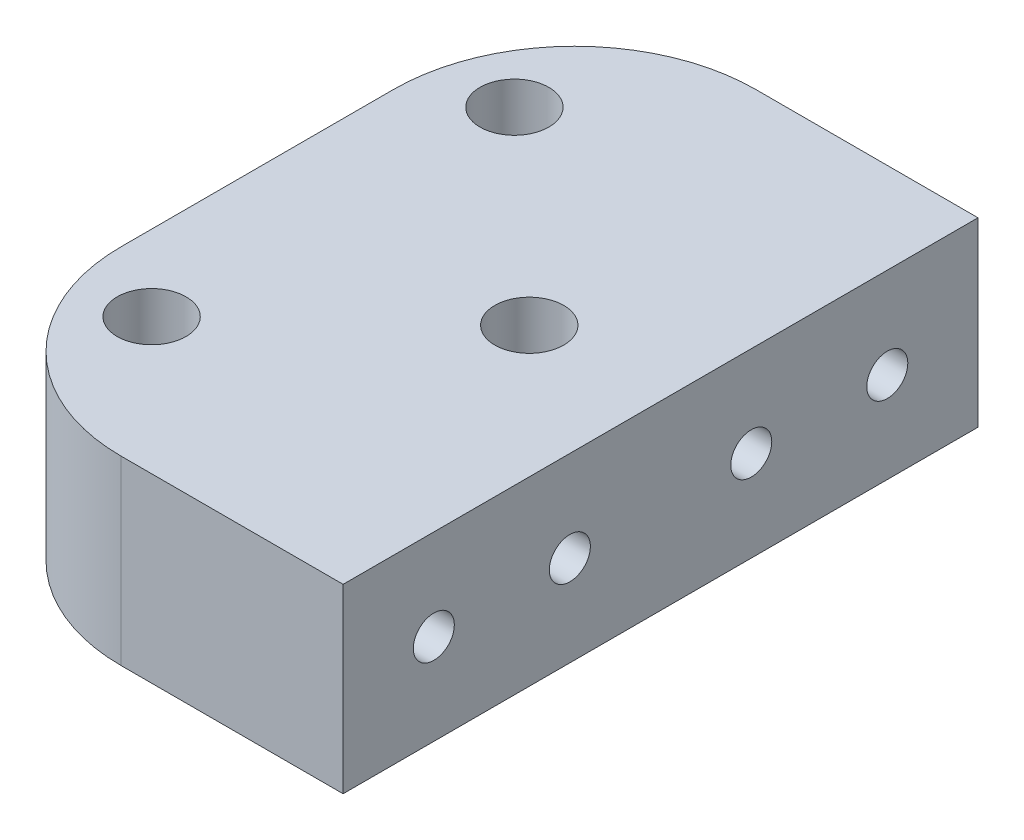
ISO-10303-21;
HEADER;
FILE_DESCRIPTION(('STEP AP214'),'2;1');
FILE_NAME('part.step','',(''),(''),'','','');
FILE_SCHEMA(('AUTOMOTIVE_DESIGN { 1 0 10303 214 1 1 1 1 }'));
ENDSEC;
DATA;
#1=APPLICATION_CONTEXT('core data for automotive mechanical design processes');
#2=APPLICATION_PROTOCOL_DEFINITION('international standard','automotive_design',2000,#1);
#3=PRODUCT_CONTEXT('',#1,'mechanical');
#4=PRODUCT('Part','Part','',(#3));
#5=PRODUCT_RELATED_PRODUCT_CATEGORY('part','',(#4));
#6=PRODUCT_DEFINITION_FORMATION('','',#4);
#7=PRODUCT_DEFINITION_CONTEXT('part definition',#1,'design');
#8=PRODUCT_DEFINITION('design','',#6,#7);
#9=PRODUCT_DEFINITION_SHAPE('','',#8);
#10=(LENGTH_UNIT() NAMED_UNIT(*) SI_UNIT(.MILLI.,.METRE.));
#11=(NAMED_UNIT(*) PLANE_ANGLE_UNIT() SI_UNIT($,.RADIAN.));
#12=(NAMED_UNIT(*) SI_UNIT($,.STERADIAN.) SOLID_ANGLE_UNIT());
#13=UNCERTAINTY_MEASURE_WITH_UNIT(LENGTH_MEASURE(1.E-05),#10,'distance_accuracy_value','');
#14=(GEOMETRIC_REPRESENTATION_CONTEXT(3) GLOBAL_UNCERTAINTY_ASSIGNED_CONTEXT((#13)) GLOBAL_UNIT_ASSIGNED_CONTEXT((#10,
#11,#12)) REPRESENTATION_CONTEXT('',''));
#15=CARTESIAN_POINT('',(0.,0.,0.));
#16=DIRECTION('',(0.,0.,1.));
#17=DIRECTION('',(1.,0.,0.));
#18=AXIS2_PLACEMENT_3D('',#15,#16,#17);
#19=CARTESIAN_POINT('',(11.11875,10.,-17.5));
#20=DIRECTION('',(-1.,0.,0.));
#21=DIRECTION('',(0.,0.,1.));
#22=AXIS2_PLACEMENT_3D('',#19,#20,#21);
#23=PLANE('',#22);
#24=CARTESIAN_POINT('',(11.11875,5.,12.5));
#25=DIRECTION('',(1.,0.,0.));
#26=DIRECTION('',(0.,0.,-1.));
#27=AXIS2_PLACEMENT_3D('',#24,#25,#26);
#28=CIRCLE('',#27,1.1303);
#29=CARTESIAN_POINT('',(11.11875,5.,11.3697));
#30=VERTEX_POINT('',#29);
#31=EDGE_CURVE('E112',#30,#30,#28,.T.);
#32=ORIENTED_EDGE('',*,*,#31,.F.);
#33=EDGE_LOOP('',(#32));
#34=FACE_BOUND('',#33,.T.);
#35=CARTESIAN_POINT('',(11.11875,5.,-12.5));
#36=DIRECTION('',(1.,0.,0.));
#37=DIRECTION('',(0.,0.,-1.));
#38=AXIS2_PLACEMENT_3D('',#35,#36,#37);
#39=CIRCLE('',#38,1.1303);
#40=CARTESIAN_POINT('',(11.11875,5.,-13.6303));
#41=VERTEX_POINT('',#40);
#42=EDGE_CURVE('E111',#41,#41,#39,.T.);
#43=ORIENTED_EDGE('',*,*,#42,.F.);
#44=EDGE_LOOP('',(#43));
#45=FACE_BOUND('',#44,.T.);
#46=CARTESIAN_POINT('',(11.11875,5.,5.));
#47=DIRECTION('',(1.,0.,0.));
#48=DIRECTION('',(0.,0.,-1.));
#49=AXIS2_PLACEMENT_3D('',#46,#47,#48);
#50=CIRCLE('',#49,1.1303);
#51=CARTESIAN_POINT('',(11.11875,5.,3.8697));
#52=VERTEX_POINT('',#51);
#53=EDGE_CURVE('E124',#52,#52,#50,.T.);
#54=ORIENTED_EDGE('',*,*,#53,.F.);
#55=EDGE_LOOP('',(#54));
#56=FACE_BOUND('',#55,.T.);
#57=CARTESIAN_POINT('',(11.11875,5.,-5.00000000000001));
#58=DIRECTION('',(1.,0.,0.));
#59=DIRECTION('',(0.,0.,-1.));
#60=AXIS2_PLACEMENT_3D('',#57,#58,#59);
#61=CIRCLE('',#60,1.1303);
#62=CARTESIAN_POINT('',(11.11875,5.,-6.1303));
#63=VERTEX_POINT('',#62);
#64=EDGE_CURVE('E130',#63,#63,#61,.T.);
#65=ORIENTED_EDGE('',*,*,#64,.F.);
#66=EDGE_LOOP('',(#65));
#67=FACE_BOUND('',#66,.T.);
#68=DIRECTION('',(0.,0.,-1.));
#69=VECTOR('',#68,1.);
#70=CARTESIAN_POINT('',(11.11875,0.,-17.5));
#71=LINE('',#70,#69);
#72=CARTESIAN_POINT('',(11.11875,0.,17.5));
#73=VERTEX_POINT('',#72);
#74=CARTESIAN_POINT('',(11.11875,0.,-17.5));
#75=VERTEX_POINT('',#74);
#76=EDGE_CURVE('E136',#73,#75,#71,.T.);
#77=ORIENTED_EDGE('',*,*,#76,.T.);
#78=DIRECTION('',(0.,-1.,0.));
#79=VECTOR('',#78,1.);
#80=CARTESIAN_POINT('',(11.11875,10.,-17.5));
#81=LINE('',#80,#79);
#82=CARTESIAN_POINT('',(11.11875,10.,-17.5));
#83=VERTEX_POINT('',#82);
#84=EDGE_CURVE('E157',#83,#75,#81,.T.);
#85=ORIENTED_EDGE('',*,*,#84,.F.);
#86=DIRECTION('',(0.,0.,-1.));
#87=VECTOR('',#86,1.);
#88=CARTESIAN_POINT('',(11.11875,10.,-17.5));
#89=LINE('',#88,#87);
#90=CARTESIAN_POINT('',(11.11875,10.,17.5));
#91=VERTEX_POINT('',#90);
#92=EDGE_CURVE('E137',#91,#83,#89,.T.);
#93=ORIENTED_EDGE('',*,*,#92,.F.);
#94=DIRECTION('',(0.,-1.,0.));
#95=VECTOR('',#94,1.);
#96=CARTESIAN_POINT('',(11.11875,10.,17.5));
#97=LINE('',#96,#95);
#98=EDGE_CURVE('E147',#91,#73,#97,.T.);
#99=ORIENTED_EDGE('',*,*,#98,.T.);
#100=EDGE_LOOP('',(#77,#85,#93,#99));
#101=FACE_BOUND('',#100,.T.);
#102=ADVANCED_FACE('F37',(#34,#45,#56,#67,#101),#23,.F.);
#103=CARTESIAN_POINT('',(-11.11875,10.,-17.5));
#104=DIRECTION('',(0.,0.,1.));
#105=DIRECTION('',(1.,0.,0.));
#106=AXIS2_PLACEMENT_3D('',#103,#104,#105);
#107=PLANE('',#106);
#108=DIRECTION('',(-1.,0.,0.));
#109=VECTOR('',#108,1.);
#110=CARTESIAN_POINT('',(-11.11875,0.,-17.5));
#111=LINE('',#110,#109);
#112=CARTESIAN_POINT('',(-1.11875,0.,-17.5));
#113=VERTEX_POINT('',#112);
#114=EDGE_CURVE('E150',#75,#113,#111,.T.);
#115=ORIENTED_EDGE('',*,*,#114,.T.);
#116=DIRECTION('',(0.,-1.,0.));
#117=VECTOR('',#116,1.);
#118=CARTESIAN_POINT('',(-1.11875,10.,-17.5));
#119=LINE('',#118,#117);
#120=CARTESIAN_POINT('',(-1.11875,10.,-17.5));
#121=VERTEX_POINT('',#120);
#122=EDGE_CURVE('E11',#113,#121,#119,.F.);
#123=ORIENTED_EDGE('',*,*,#122,.T.);
#124=DIRECTION('',(-1.,0.,0.));
#125=VECTOR('',#124,1.);
#126=CARTESIAN_POINT('',(-11.11875,10.,-17.5));
#127=LINE('',#126,#125);
#128=EDGE_CURVE('E140',#83,#121,#127,.T.);
#129=ORIENTED_EDGE('',*,*,#128,.F.);
#130=ORIENTED_EDGE('',*,*,#84,.T.);
#131=EDGE_LOOP('',(#115,#123,#129,#130));
#132=FACE_BOUND('',#131,.T.);
#133=ADVANCED_FACE('F192',(#132),#107,.F.);
#134=CARTESIAN_POINT('',(-11.11875,10.,-17.5));
#135=DIRECTION('',(1.,0.,0.));
#136=DIRECTION('',(0.,0.,-1.));
#137=AXIS2_PLACEMENT_3D('',#134,#135,#136);
#138=PLANE('',#137);
#139=DIRECTION('',(0.,0.,1.));
#140=VECTOR('',#139,1.);
#141=CARTESIAN_POINT('',(-11.11875,0.,-17.5));
#142=LINE('',#141,#140);
#143=CARTESIAN_POINT('',(-11.11875,0.,-7.5));
#144=VERTEX_POINT('',#143);
#145=CARTESIAN_POINT('',(-11.11875,0.,7.5));
#146=VERTEX_POINT('',#145);
#147=EDGE_CURVE('E152',#144,#146,#142,.T.);
#148=ORIENTED_EDGE('',*,*,#147,.T.);
#149=DIRECTION('',(0.,-1.,0.));
#150=VECTOR('',#149,1.);
#151=CARTESIAN_POINT('',(-11.11875,10.,7.5));
#152=LINE('',#151,#150);
#153=CARTESIAN_POINT('',(-11.11875,10.,7.5));
#154=VERTEX_POINT('',#153);
#155=EDGE_CURVE('E58',#146,#154,#152,.F.);
#156=ORIENTED_EDGE('',*,*,#155,.T.);
#157=DIRECTION('',(0.,0.,1.));
#158=VECTOR('',#157,1.);
#159=CARTESIAN_POINT('',(-11.11875,10.,-17.5));
#160=LINE('',#159,#158);
#161=CARTESIAN_POINT('',(-11.11875,10.,-7.5));
#162=VERTEX_POINT('',#161);
#163=EDGE_CURVE('E143',#162,#154,#160,.T.);
#164=ORIENTED_EDGE('',*,*,#163,.F.);
#165=DIRECTION('',(0.,-1.,0.));
#166=VECTOR('',#165,1.);
#167=CARTESIAN_POINT('',(-11.11875,10.,-7.5));
#168=LINE('',#167,#166);
#169=EDGE_CURVE('E167',#162,#144,#168,.T.);
#170=ORIENTED_EDGE('',*,*,#169,.T.);
#171=EDGE_LOOP('',(#148,#156,#164,#170));
#172=FACE_BOUND('',#171,.T.);
#173=ADVANCED_FACE('F188',(#172),#138,.F.);
#174=CARTESIAN_POINT('',(-11.11875,10.,17.5));
#175=DIRECTION('',(0.,0.,-1.));
#176=DIRECTION('',(-1.,0.,0.));
#177=AXIS2_PLACEMENT_3D('',#174,#175,#176);
#178=PLANE('',#177);
#179=DIRECTION('',(1.,0.,0.));
#180=VECTOR('',#179,1.);
#181=CARTESIAN_POINT('',(-11.11875,10.,17.5));
#182=LINE('',#181,#180);
#183=CARTESIAN_POINT('',(-1.11875,10.,17.5));
#184=VERTEX_POINT('',#183);
#185=EDGE_CURVE('E145',#184,#91,#182,.T.);
#186=ORIENTED_EDGE('',*,*,#185,.F.);
#187=DIRECTION('',(0.,-1.,0.));
#188=VECTOR('',#187,1.);
#189=CARTESIAN_POINT('',(-1.11875,10.,17.5));
#190=LINE('',#189,#188);
#191=CARTESIAN_POINT('',(-1.11875,0.,17.5));
#192=VERTEX_POINT('',#191);
#193=EDGE_CURVE('E160',#184,#192,#190,.T.);
#194=ORIENTED_EDGE('',*,*,#193,.T.);
#195=DIRECTION('',(1.,0.,0.));
#196=VECTOR('',#195,1.);
#197=CARTESIAN_POINT('',(-11.11875,0.,17.5));
#198=LINE('',#197,#196);
#199=EDGE_CURVE('E141',#192,#73,#198,.T.);
#200=ORIENTED_EDGE('',*,*,#199,.T.);
#201=ORIENTED_EDGE('',*,*,#98,.F.);
#202=EDGE_LOOP('',(#186,#194,#200,#201));
#203=FACE_BOUND('',#202,.T.);
#204=ADVANCED_FACE('F180',(#203),#178,.F.);
#205=CARTESIAN_POINT('',(0.,10.,0.));
#206=DIRECTION('',(0.,1.,0.));
#207=DIRECTION('',(0.,0.,1.));
#208=AXIS2_PLACEMENT_3D('',#205,#206,#207);
#209=PLANE('',#208);
#210=CARTESIAN_POINT('',(3.88125,10.,0.));
#211=DIRECTION('',(0.,1.,0.));
#212=DIRECTION('',(0.,0.,1.));
#213=AXIS2_PLACEMENT_3D('',#210,#211,#212);
#214=CIRCLE('',#213,1.89864999999999);
#215=CARTESIAN_POINT('',(3.88125,10.,1.89864999999999));
#216=VERTEX_POINT('',#215);
#217=EDGE_CURVE('E401',#216,#216,#214,.T.);
#218=ORIENTED_EDGE('',*,*,#217,.F.);
#219=EDGE_LOOP('',(#218));
#220=FACE_BOUND('',#219,.T.);
#221=CARTESIAN_POINT('',(-6.93875,10.,-10.));
#222=DIRECTION('',(0.,1.,0.));
#223=DIRECTION('',(0.,0.,1.));
#224=AXIS2_PLACEMENT_3D('',#221,#222,#223);
#225=CIRCLE('',#224,1.89864999999999);
#226=CARTESIAN_POINT('',(-6.93875,10.,-8.10135000000001));
#227=VERTEX_POINT('',#226);
#228=EDGE_CURVE('E397',#227,#227,#225,.T.);
#229=ORIENTED_EDGE('',*,*,#228,.F.);
#230=EDGE_LOOP('',(#229));
#231=FACE_BOUND('',#230,.T.);
#232=CARTESIAN_POINT('',(-6.93875,10.,10.));
#233=DIRECTION('',(0.,1.,0.));
#234=DIRECTION('',(0.,0.,1.));
#235=AXIS2_PLACEMENT_3D('',#232,#233,#234);
#236=CIRCLE('',#235,1.89864999999999);
#237=CARTESIAN_POINT('',(-6.93875,10.,11.89865));
#238=VERTEX_POINT('',#237);
#239=EDGE_CURVE('E392',#238,#238,#236,.T.);
#240=ORIENTED_EDGE('',*,*,#239,.F.);
#241=EDGE_LOOP('',(#240));
#242=FACE_BOUND('',#241,.T.);
#243=ORIENTED_EDGE('',*,*,#163,.T.);
#244=CARTESIAN_POINT('',(-1.11875,10.,7.5));
#245=DIRECTION('',(0.,1.,0.));
#246=DIRECTION('',(0.,0.,1.));
#247=AXIS2_PLACEMENT_3D('',#244,#245,#246);
#248=CIRCLE('',#247,10.);
#249=EDGE_CURVE('E45',#154,#184,#248,.T.);
#250=ORIENTED_EDGE('',*,*,#249,.T.);
#251=ORIENTED_EDGE('',*,*,#185,.T.);
#252=ORIENTED_EDGE('',*,*,#92,.T.);
#253=ORIENTED_EDGE('',*,*,#128,.T.);
#254=CARTESIAN_POINT('',(-1.11875,10.,-7.5));
#255=DIRECTION('',(0.,1.,0.));
#256=DIRECTION('',(0.,0.,1.));
#257=AXIS2_PLACEMENT_3D('',#254,#255,#256);
#258=CIRCLE('',#257,10.);
#259=EDGE_CURVE('E171',#121,#162,#258,.T.);
#260=ORIENTED_EDGE('',*,*,#259,.T.);
#261=EDGE_LOOP('',(#243,#250,#251,#252,#253,#260));
#262=FACE_BOUND('',#261,.T.);
#263=ADVANCED_FACE('F175',(#220,#231,#242,#262),#209,.T.);
#264=CARTESIAN_POINT('',(0.,0.,0.));
#265=DIRECTION('',(0.,1.,0.));
#266=DIRECTION('',(0.,0.,1.));
#267=AXIS2_PLACEMENT_3D('',#264,#265,#266);
#268=PLANE('',#267);
#269=CARTESIAN_POINT('',(3.88125,0.,0.));
#270=DIRECTION('',(0.,1.,0.));
#271=DIRECTION('',(0.,0.,1.));
#272=AXIS2_PLACEMENT_3D('',#269,#270,#271);
#273=CIRCLE('',#272,1.89865);
#274=CARTESIAN_POINT('',(3.88125,0.,1.89865));
#275=VERTEX_POINT('',#274);
#276=EDGE_CURVE('E385',#275,#275,#273,.T.);
#277=ORIENTED_EDGE('',*,*,#276,.T.);
#278=EDGE_LOOP('',(#277));
#279=FACE_BOUND('',#278,.T.);
#280=CARTESIAN_POINT('',(-6.93875,0.,-10.));
#281=DIRECTION('',(0.,1.,0.));
#282=DIRECTION('',(0.,0.,1.));
#283=AXIS2_PLACEMENT_3D('',#280,#281,#282);
#284=CIRCLE('',#283,1.89865);
#285=CARTESIAN_POINT('',(-6.93875,0.,-8.10135));
#286=VERTEX_POINT('',#285);
#287=EDGE_CURVE('E389',#286,#286,#284,.T.);
#288=ORIENTED_EDGE('',*,*,#287,.T.);
#289=EDGE_LOOP('',(#288));
#290=FACE_BOUND('',#289,.T.);
#291=CARTESIAN_POINT('',(-6.93875,0.,10.));
#292=DIRECTION('',(0.,1.,0.));
#293=DIRECTION('',(0.,0.,1.));
#294=AXIS2_PLACEMENT_3D('',#291,#292,#293);
#295=CIRCLE('',#294,1.89865);
#296=CARTESIAN_POINT('',(-6.93875,0.,11.89865));
#297=VERTEX_POINT('',#296);
#298=EDGE_CURVE('E118',#297,#297,#295,.T.);
#299=ORIENTED_EDGE('',*,*,#298,.T.);
#300=EDGE_LOOP('',(#299));
#301=FACE_BOUND('',#300,.T.);
#302=ORIENTED_EDGE('',*,*,#199,.F.);
#303=CARTESIAN_POINT('',(-1.11875,0.,7.5));
#304=DIRECTION('',(0.,1.,0.));
#305=DIRECTION('',(0.,0.,1.));
#306=AXIS2_PLACEMENT_3D('',#303,#304,#305);
#307=CIRCLE('',#306,10.);
#308=EDGE_CURVE('E165',#192,#146,#307,.F.);
#309=ORIENTED_EDGE('',*,*,#308,.T.);
#310=ORIENTED_EDGE('',*,*,#147,.F.);
#311=CARTESIAN_POINT('',(-1.11875,0.,-7.5));
#312=DIRECTION('',(0.,1.,0.));
#313=DIRECTION('',(0.,0.,1.));
#314=AXIS2_PLACEMENT_3D('',#311,#312,#313);
#315=CIRCLE('',#314,10.);
#316=EDGE_CURVE('E163',#144,#113,#315,.F.);
#317=ORIENTED_EDGE('',*,*,#316,.T.);
#318=ORIENTED_EDGE('',*,*,#114,.F.);
#319=ORIENTED_EDGE('',*,*,#76,.F.);
#320=EDGE_LOOP('',(#302,#309,#310,#317,#318,#319));
#321=FACE_BOUND('',#320,.T.);
#322=ADVANCED_FACE('F186',(#279,#290,#301,#321),#268,.F.);
#323=CARTESIAN_POINT('',(3.51875,5.,-5.00000000000001));
#324=DIRECTION('',(1.,0.,0.));
#325=DIRECTION('',(0.,0.,-1.));
#326=AXIS2_PLACEMENT_3D('',#323,#324,#325);
#327=CONICAL_SURFACE('',#326,1.1303,1.02974425867665);
#328=CARTESIAN_POINT('',(2.83959724231315,5.,-5.00000000000001));
#329=VERTEX_POINT('',#328);
#330=VERTEX_LOOP('',#329);
#331=FACE_BOUND('',#330,.T.);
#332=CARTESIAN_POINT('',(3.51875,5.,-5.00000000000001));
#333=DIRECTION('',(1.,0.,0.));
#334=DIRECTION('',(0.,0.,-1.));
#335=AXIS2_PLACEMENT_3D('',#332,#333,#334);
#336=CIRCLE('',#335,1.1303);
#337=CARTESIAN_POINT('',(3.51875,5.,-6.1303));
#338=VERTEX_POINT('',#337);
#339=EDGE_CURVE('E133',#338,#338,#336,.T.);
#340=ORIENTED_EDGE('',*,*,#339,.T.);
#341=EDGE_LOOP('',(#340));
#342=FACE_BOUND('',#341,.T.);
#343=ADVANCED_FACE('F246',(#331,#342),#327,.F.);
#344=CARTESIAN_POINT('',(11.11875,5.,-5.00000000000001));
#345=DIRECTION('',(1.,0.,0.));
#346=DIRECTION('',(0.,0.,-1.));
#347=AXIS2_PLACEMENT_3D('',#344,#345,#346);
#348=CYLINDRICAL_SURFACE('',#347,1.1303);
#349=ORIENTED_EDGE('',*,*,#339,.F.);
#350=EDGE_LOOP('',(#349));
#351=FACE_BOUND('',#350,.T.);
#352=ORIENTED_EDGE('',*,*,#64,.T.);
#353=EDGE_LOOP('',(#352));
#354=FACE_BOUND('',#353,.T.);
#355=ADVANCED_FACE('F242',(#351,#354),#348,.F.);
#356=CARTESIAN_POINT('',(3.51875,5.,5.));
#357=DIRECTION('',(1.,0.,0.));
#358=DIRECTION('',(0.,0.,-1.));
#359=AXIS2_PLACEMENT_3D('',#356,#357,#358);
#360=CONICAL_SURFACE('',#359,1.1303,1.02974425867665);
#361=CARTESIAN_POINT('',(2.83959724231315,5.,5.));
#362=VERTEX_POINT('',#361);
#363=VERTEX_LOOP('',#362);
#364=FACE_BOUND('',#363,.T.);
#365=CARTESIAN_POINT('',(3.51875,5.,5.));
#366=DIRECTION('',(1.,0.,0.));
#367=DIRECTION('',(0.,0.,-1.));
#368=AXIS2_PLACEMENT_3D('',#365,#366,#367);
#369=CIRCLE('',#368,1.1303);
#370=CARTESIAN_POINT('',(3.51875,5.,3.8697));
#371=VERTEX_POINT('',#370);
#372=EDGE_CURVE('E127',#371,#371,#369,.T.);
#373=ORIENTED_EDGE('',*,*,#372,.T.);
#374=EDGE_LOOP('',(#373));
#375=FACE_BOUND('',#374,.T.);
#376=ADVANCED_FACE('F238',(#364,#375),#360,.F.);
#377=CARTESIAN_POINT('',(11.11875,5.,5.));
#378=DIRECTION('',(1.,0.,0.));
#379=DIRECTION('',(0.,0.,-1.));
#380=AXIS2_PLACEMENT_3D('',#377,#378,#379);
#381=CYLINDRICAL_SURFACE('',#380,1.1303);
#382=ORIENTED_EDGE('',*,*,#372,.F.);
#383=EDGE_LOOP('',(#382));
#384=FACE_BOUND('',#383,.T.);
#385=ORIENTED_EDGE('',*,*,#53,.T.);
#386=EDGE_LOOP('',(#385));
#387=FACE_BOUND('',#386,.T.);
#388=ADVANCED_FACE('F234',(#384,#387),#381,.F.);
#389=CARTESIAN_POINT('',(3.51875,5.,-12.5));
#390=DIRECTION('',(1.,0.,0.));
#391=DIRECTION('',(0.,0.,-1.));
#392=AXIS2_PLACEMENT_3D('',#389,#390,#391);
#393=CONICAL_SURFACE('',#392,1.1303,1.02974425867665);
#394=CARTESIAN_POINT('',(2.83959724231315,5.,-12.5));
#395=VERTEX_POINT('',#394);
#396=VERTEX_LOOP('',#395);
#397=FACE_BOUND('',#396,.T.);
#398=CARTESIAN_POINT('',(3.51875,5.,-12.5));
#399=DIRECTION('',(1.,0.,0.));
#400=DIRECTION('',(0.,0.,-1.));
#401=AXIS2_PLACEMENT_3D('',#398,#399,#400);
#402=CIRCLE('',#401,1.1303);
#403=CARTESIAN_POINT('',(3.51875,5.,-13.6303));
#404=VERTEX_POINT('',#403);
#405=EDGE_CURVE('E115',#404,#404,#402,.T.);
#406=ORIENTED_EDGE('',*,*,#405,.T.);
#407=EDGE_LOOP('',(#406));
#408=FACE_BOUND('',#407,.T.);
#409=ADVANCED_FACE('F230',(#397,#408),#393,.F.);
#410=CARTESIAN_POINT('',(11.11875,5.,-12.5));
#411=DIRECTION('',(1.,0.,0.));
#412=DIRECTION('',(0.,0.,-1.));
#413=AXIS2_PLACEMENT_3D('',#410,#411,#412);
#414=CYLINDRICAL_SURFACE('',#413,1.1303);
#415=ORIENTED_EDGE('',*,*,#405,.F.);
#416=EDGE_LOOP('',(#415));
#417=FACE_BOUND('',#416,.T.);
#418=ORIENTED_EDGE('',*,*,#42,.T.);
#419=EDGE_LOOP('',(#418));
#420=FACE_BOUND('',#419,.T.);
#421=ADVANCED_FACE('F105',(#417,#420),#414,.F.);
#422=CARTESIAN_POINT('',(3.51875,5.,12.5));
#423=DIRECTION('',(1.,0.,0.));
#424=DIRECTION('',(0.,0.,-1.));
#425=AXIS2_PLACEMENT_3D('',#422,#423,#424);
#426=CONICAL_SURFACE('',#425,1.1303,1.02974425867665);
#427=CARTESIAN_POINT('',(2.83959724231315,5.,12.5));
#428=VERTEX_POINT('',#427);
#429=VERTEX_LOOP('',#428);
#430=FACE_BOUND('',#429,.T.);
#431=CARTESIAN_POINT('',(3.51875,5.,12.5));
#432=DIRECTION('',(1.,0.,0.));
#433=DIRECTION('',(0.,0.,-1.));
#434=AXIS2_PLACEMENT_3D('',#431,#432,#433);
#435=CIRCLE('',#434,1.1303);
#436=CARTESIAN_POINT('',(3.51875,5.,11.3697));
#437=VERTEX_POINT('',#436);
#438=EDGE_CURVE('E109',#437,#437,#435,.T.);
#439=ORIENTED_EDGE('',*,*,#438,.T.);
#440=EDGE_LOOP('',(#439));
#441=FACE_BOUND('',#440,.T.);
#442=ADVANCED_FACE('F101',(#430,#441),#426,.F.);
#443=CARTESIAN_POINT('',(11.11875,5.,12.5));
#444=DIRECTION('',(1.,0.,0.));
#445=DIRECTION('',(0.,0.,-1.));
#446=AXIS2_PLACEMENT_3D('',#443,#444,#445);
#447=CYLINDRICAL_SURFACE('',#446,1.1303);
#448=ORIENTED_EDGE('',*,*,#438,.F.);
#449=EDGE_LOOP('',(#448));
#450=FACE_BOUND('',#449,.T.);
#451=ORIENTED_EDGE('',*,*,#31,.T.);
#452=EDGE_LOOP('',(#451));
#453=FACE_BOUND('',#452,.T.);
#454=ADVANCED_FACE('F104',(#450,#453),#447,.F.);
#455=CARTESIAN_POINT('',(-6.93875,10.,10.));
#456=DIRECTION('',(0.,1.,0.));
#457=DIRECTION('',(0.,0.,1.));
#458=AXIS2_PLACEMENT_3D('',#455,#456,#457);
#459=CYLINDRICAL_SURFACE('',#458,1.89864999999999);
#460=ORIENTED_EDGE('',*,*,#298,.F.);
#461=EDGE_LOOP('',(#460));
#462=FACE_BOUND('',#461,.T.);
#463=ORIENTED_EDGE('',*,*,#239,.T.);
#464=EDGE_LOOP('',(#463));
#465=FACE_BOUND('',#464,.T.);
#466=ADVANCED_FACE('F217',(#462,#465),#459,.F.);
#467=CARTESIAN_POINT('',(-6.93875,10.,-10.));
#468=DIRECTION('',(0.,1.,0.));
#469=DIRECTION('',(0.,0.,1.));
#470=AXIS2_PLACEMENT_3D('',#467,#468,#469);
#471=CYLINDRICAL_SURFACE('',#470,1.89864999999999);
#472=ORIENTED_EDGE('',*,*,#287,.F.);
#473=EDGE_LOOP('',(#472));
#474=FACE_BOUND('',#473,.T.);
#475=ORIENTED_EDGE('',*,*,#228,.T.);
#476=EDGE_LOOP('',(#475));
#477=FACE_BOUND('',#476,.T.);
#478=ADVANCED_FACE('F211',(#474,#477),#471,.F.);
#479=CARTESIAN_POINT('',(3.88125,10.,0.));
#480=DIRECTION('',(0.,1.,0.));
#481=DIRECTION('',(0.,0.,1.));
#482=AXIS2_PLACEMENT_3D('',#479,#480,#481);
#483=CYLINDRICAL_SURFACE('',#482,1.89864999999999);
#484=ORIENTED_EDGE('',*,*,#276,.F.);
#485=EDGE_LOOP('',(#484));
#486=FACE_BOUND('',#485,.T.);
#487=ORIENTED_EDGE('',*,*,#217,.T.);
#488=EDGE_LOOP('',(#487));
#489=FACE_BOUND('',#488,.T.);
#490=ADVANCED_FACE('F206',(#486,#489),#483,.F.);
#491=CARTESIAN_POINT('',(-1.11875,10.,7.5));
#492=DIRECTION('',(0.,-1.,0.));
#493=DIRECTION('',(0.,0.,-1.));
#494=AXIS2_PLACEMENT_3D('',#491,#492,#493);
#495=CYLINDRICAL_SURFACE('',#494,10.);
#496=ORIENTED_EDGE('',*,*,#249,.F.);
#497=ORIENTED_EDGE('',*,*,#155,.F.);
#498=ORIENTED_EDGE('',*,*,#308,.F.);
#499=ORIENTED_EDGE('',*,*,#193,.F.);
#500=EDGE_LOOP('',(#496,#497,#498,#499));
#501=FACE_BOUND('',#500,.T.);
#502=ADVANCED_FACE('F183',(#501),#495,.T.);
#503=CARTESIAN_POINT('',(-1.11875,10.,-7.5));
#504=DIRECTION('',(0.,-1.,0.));
#505=DIRECTION('',(0.,0.,-1.));
#506=AXIS2_PLACEMENT_3D('',#503,#504,#505);
#507=CYLINDRICAL_SURFACE('',#506,10.);
#508=ORIENTED_EDGE('',*,*,#259,.F.);
#509=ORIENTED_EDGE('',*,*,#122,.F.);
#510=ORIENTED_EDGE('',*,*,#316,.F.);
#511=ORIENTED_EDGE('',*,*,#169,.F.);
#512=EDGE_LOOP('',(#508,#509,#510,#511));
#513=FACE_BOUND('',#512,.T.);
#514=ADVANCED_FACE('F39',(#513),#507,.T.);
#515=CLOSED_SHELL('',(#102,#133,#173,#204,#263,#322,#343,#355,#376,#388,#409,#421,#442,#454,
#466,#478,#490,#502,#514));
#516=MANIFOLD_SOLID_BREP('B2',#515);
#517=ADVANCED_BREP_SHAPE_REPRESENTATION('',(#18,#516),#14);
#518=SHAPE_DEFINITION_REPRESENTATION(#9,#517);
ENDSEC;
END-ISO-10303-21;
